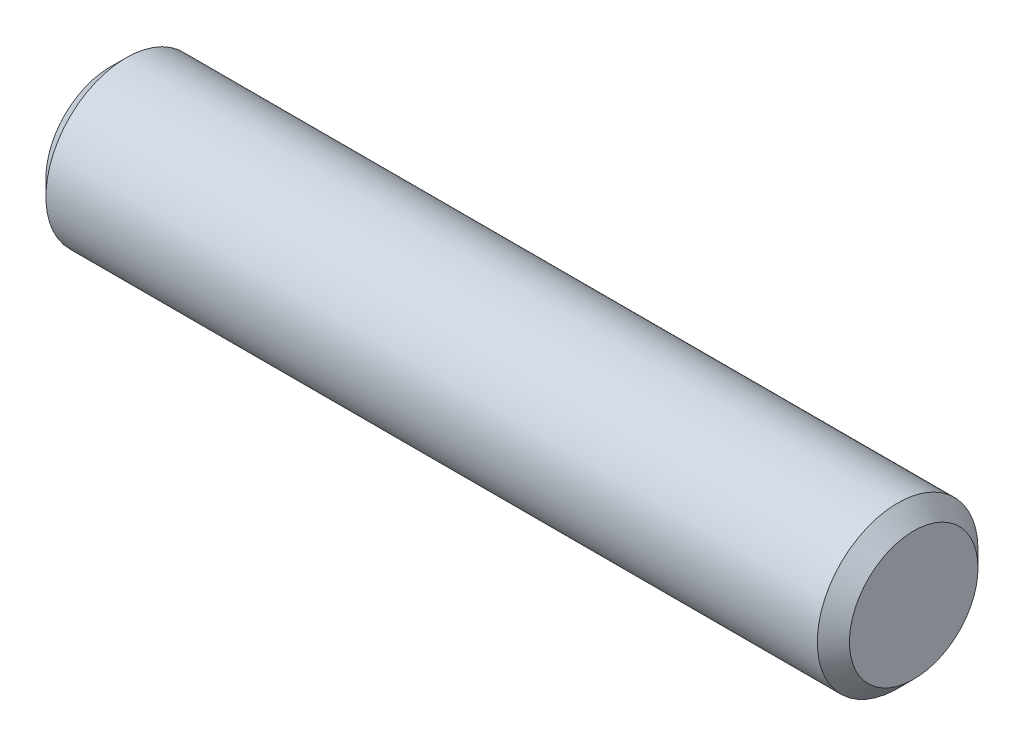
ISO-10303-21;
HEADER;
FILE_DESCRIPTION(('STEP AP214'),'2;1');
FILE_NAME('part.step','',(''),(''),'','','');
FILE_SCHEMA(('AUTOMOTIVE_DESIGN { 1 0 10303 214 1 1 1 1 }'));
ENDSEC;
DATA;
#1=APPLICATION_CONTEXT('core data for automotive mechanical design processes');
#2=APPLICATION_PROTOCOL_DEFINITION('international standard','automotive_design',2000,#1);
#3=PRODUCT_CONTEXT('',#1,'mechanical');
#4=PRODUCT('Part','Part','',(#3));
#5=PRODUCT_RELATED_PRODUCT_CATEGORY('part','',(#4));
#6=PRODUCT_DEFINITION_FORMATION('','',#4);
#7=PRODUCT_DEFINITION_CONTEXT('part definition',#1,'design');
#8=PRODUCT_DEFINITION('design','',#6,#7);
#9=PRODUCT_DEFINITION_SHAPE('','',#8);
#10=(LENGTH_UNIT() NAMED_UNIT(*) SI_UNIT(.MILLI.,.METRE.));
#11=(NAMED_UNIT(*) PLANE_ANGLE_UNIT() SI_UNIT($,.RADIAN.));
#12=(NAMED_UNIT(*) SI_UNIT($,.STERADIAN.) SOLID_ANGLE_UNIT());
#13=UNCERTAINTY_MEASURE_WITH_UNIT(LENGTH_MEASURE(1.E-05),#10,'distance_accuracy_value','');
#14=(GEOMETRIC_REPRESENTATION_CONTEXT(3) GLOBAL_UNCERTAINTY_ASSIGNED_CONTEXT((#13)) GLOBAL_UNIT_ASSIGNED_CONTEXT((#10,
#11,#12)) REPRESENTATION_CONTEXT('',''));
#15=CARTESIAN_POINT('',(0.,0.,0.));
#16=DIRECTION('',(0.,0.,1.));
#17=DIRECTION('',(1.,0.,0.));
#18=AXIS2_PLACEMENT_3D('',#15,#16,#17);
#19=CARTESIAN_POINT('',(-63.5000000000001,0.,0.));
#20=DIRECTION('',(1.,0.,0.));
#21=DIRECTION('',(0.,0.,-1.));
#22=AXIS2_PLACEMENT_3D('',#19,#20,#21);
#23=CYLINDRICAL_SURFACE('',#22,12.7);
#24=CARTESIAN_POINT('',(60.9600000000001,0.,0.));
#25=DIRECTION('',(1.,0.,0.));
#26=DIRECTION('',(0.,0.,-1.));
#27=AXIS2_PLACEMENT_3D('',#24,#25,#26);
#28=CIRCLE('',#27,12.7);
#29=CARTESIAN_POINT('',(60.9600000000001,0.,-12.7));
#30=VERTEX_POINT('',#29);
#31=EDGE_CURVE('E40',#30,#30,#28,.F.);
#32=ORIENTED_EDGE('',*,*,#31,.T.);
#33=EDGE_LOOP('',(#32));
#34=FACE_BOUND('',#33,.T.);
#35=CARTESIAN_POINT('',(-60.9600000000001,0.,0.));
#36=DIRECTION('',(1.,0.,0.));
#37=DIRECTION('',(0.,0.,-1.));
#38=AXIS2_PLACEMENT_3D('',#35,#36,#37);
#39=CIRCLE('',#38,12.7);
#40=CARTESIAN_POINT('',(-60.9600000000001,0.,-12.7));
#41=VERTEX_POINT('',#40);
#42=EDGE_CURVE('E44',#41,#41,#39,.T.);
#43=ORIENTED_EDGE('',*,*,#42,.T.);
#44=EDGE_LOOP('',(#43));
#45=FACE_BOUND('',#44,.T.);
#46=ADVANCED_FACE('F33',(#34,#45),#23,.T.);
#47=CARTESIAN_POINT('',(-63.5000000000001,0.,0.));
#48=DIRECTION('',(1.,0.,0.));
#49=DIRECTION('',(0.,0.,-1.));
#50=AXIS2_PLACEMENT_3D('',#47,#48,#49);
#51=PLANE('',#50);
#52=CARTESIAN_POINT('',(-63.5000000000001,0.,0.));
#53=DIRECTION('',(1.,0.,0.));
#54=DIRECTION('',(0.,0.,-1.));
#55=AXIS2_PLACEMENT_3D('',#52,#53,#54);
#56=CIRCLE('',#55,10.16);
#57=CARTESIAN_POINT('',(-63.5000000000001,0.,-10.16));
#58=VERTEX_POINT('',#57);
#59=EDGE_CURVE('E10',#58,#58,#56,.F.);
#60=ORIENTED_EDGE('',*,*,#59,.T.);
#61=EDGE_LOOP('',(#60));
#62=FACE_BOUND('',#61,.T.);
#63=ADVANCED_FACE('F64',(#62),#51,.F.);
#64=CARTESIAN_POINT('',(63.5000000000001,0.,0.));
#65=DIRECTION('',(1.,0.,0.));
#66=DIRECTION('',(0.,0.,-1.));
#67=AXIS2_PLACEMENT_3D('',#64,#65,#66);
#68=PLANE('',#67);
#69=CARTESIAN_POINT('',(63.5000000000001,0.,0.));
#70=DIRECTION('',(1.,0.,0.));
#71=DIRECTION('',(0.,0.,-1.));
#72=AXIS2_PLACEMENT_3D('',#69,#70,#71);
#73=CIRCLE('',#72,10.16);
#74=CARTESIAN_POINT('',(63.5000000000001,0.,-10.16));
#75=VERTEX_POINT('',#74);
#76=EDGE_CURVE('E48',#75,#75,#73,.T.);
#77=ORIENTED_EDGE('',*,*,#76,.T.);
#78=EDGE_LOOP('',(#77));
#79=FACE_BOUND('',#78,.T.);
#80=ADVANCED_FACE('F54',(#79),#68,.T.);
#81=CARTESIAN_POINT('',(63.5000000000001,0.,0.));
#82=DIRECTION('',(-1.,0.,0.));
#83=DIRECTION('',(0.,0.,1.));
#84=AXIS2_PLACEMENT_3D('',#81,#82,#83);
#85=CONICAL_SURFACE('',#84,10.16,0.78539816339745);
#86=ORIENTED_EDGE('',*,*,#31,.F.);
#87=EDGE_LOOP('',(#86));
#88=FACE_BOUND('',#87,.T.);
#89=ORIENTED_EDGE('',*,*,#76,.F.);
#90=EDGE_LOOP('',(#89));
#91=FACE_BOUND('',#90,.T.);
#92=ADVANCED_FACE('F56',(#88,#91),#85,.T.);
#93=CARTESIAN_POINT('',(-60.9600000000001,0.,0.));
#94=DIRECTION('',(1.,0.,0.));
#95=DIRECTION('',(0.,0.,-1.));
#96=AXIS2_PLACEMENT_3D('',#93,#94,#95);
#97=CONICAL_SURFACE('',#96,12.7,0.78539816339745);
#98=ORIENTED_EDGE('',*,*,#59,.F.);
#99=EDGE_LOOP('',(#98));
#100=FACE_BOUND('',#99,.T.);
#101=ORIENTED_EDGE('',*,*,#42,.F.);
#102=EDGE_LOOP('',(#101));
#103=FACE_BOUND('',#102,.T.);
#104=ADVANCED_FACE('F35',(#100,#103),#97,.T.);
#105=CLOSED_SHELL('',(#46,#63,#80,#92,#104));
#106=MANIFOLD_SOLID_BREP('B2',#105);
#107=ADVANCED_BREP_SHAPE_REPRESENTATION('',(#18,#106),#14);
#108=SHAPE_DEFINITION_REPRESENTATION(#9,#107);
ENDSEC;
END-ISO-10303-21;
